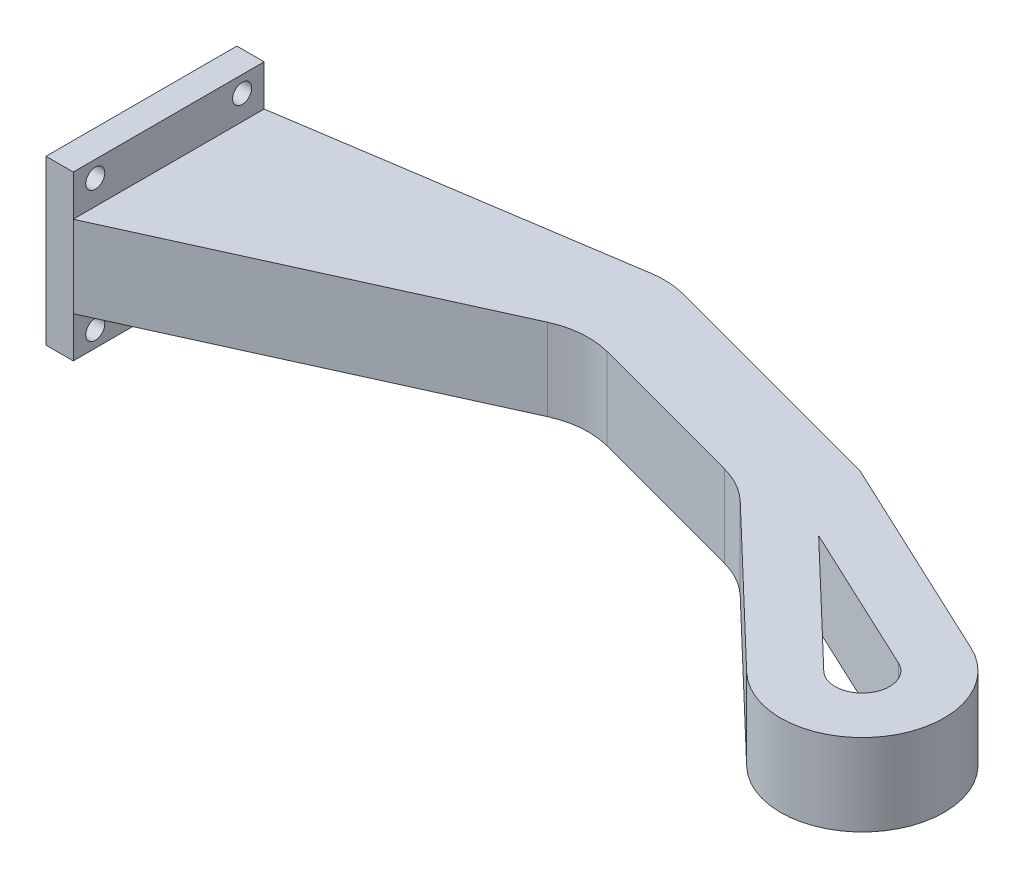
ISO-10303-21;
HEADER;
FILE_DESCRIPTION(('STEP AP214'),'2;1');
FILE_NAME('part.step','',(''),(''),'','','');
FILE_SCHEMA(('AUTOMOTIVE_DESIGN { 1 0 10303 214 1 1 1 1 }'));
ENDSEC;
DATA;
#1=APPLICATION_CONTEXT('core data for automotive mechanical design processes');
#2=APPLICATION_PROTOCOL_DEFINITION('international standard','automotive_design',2000,#1);
#3=PRODUCT_CONTEXT('',#1,'mechanical');
#4=PRODUCT('Part','Part','',(#3));
#5=PRODUCT_RELATED_PRODUCT_CATEGORY('part','',(#4));
#6=PRODUCT_DEFINITION_FORMATION('','',#4);
#7=PRODUCT_DEFINITION_CONTEXT('part definition',#1,'design');
#8=PRODUCT_DEFINITION('design','',#6,#7);
#9=PRODUCT_DEFINITION_SHAPE('','',#8);
#10=(LENGTH_UNIT() NAMED_UNIT(*) SI_UNIT(.MILLI.,.METRE.));
#11=(NAMED_UNIT(*) PLANE_ANGLE_UNIT() SI_UNIT($,.RADIAN.));
#12=(NAMED_UNIT(*) SI_UNIT($,.STERADIAN.) SOLID_ANGLE_UNIT());
#13=UNCERTAINTY_MEASURE_WITH_UNIT(LENGTH_MEASURE(1.E-05),#10,'distance_accuracy_value','');
#14=(GEOMETRIC_REPRESENTATION_CONTEXT(3) GLOBAL_UNCERTAINTY_ASSIGNED_CONTEXT((#13)) GLOBAL_UNIT_ASSIGNED_CONTEXT((#10,
#11,#12)) REPRESENTATION_CONTEXT('',''));
#15=CARTESIAN_POINT('',(0.,0.,0.));
#16=DIRECTION('',(0.,0.,1.));
#17=DIRECTION('',(1.,0.,0.));
#18=AXIS2_PLACEMENT_3D('',#15,#16,#17);
#19=CARTESIAN_POINT('',(149.048915943772,7.5,16.8647755984582));
#20=DIRECTION('',(0.,1.,0.));
#21=DIRECTION('',(0.,0.,1.));
#22=AXIS2_PLACEMENT_3D('',#19,#20,#21);
#23=PLANE('',#22);
#24=DIRECTION('',(-0.965903534010619,0.,-0.258902226691461));
#25=VECTOR('',#24,1.);
#26=CARTESIAN_POINT('',(69.6997046291097,7.5,-27.3658109257044));
#27=LINE('',#26,#25);
#28=CARTESIAN_POINT('',(117.129901337432,7.5,-14.6525501208592));
#29=VERTEX_POINT('',#28);
#30=CARTESIAN_POINT('',(72.7364139699548,7.5,-26.5518468159604));
#31=VERTEX_POINT('',#30);
#32=EDGE_CURVE('E249',#29,#31,#27,.T.);
#33=ORIENTED_EDGE('',*,*,#32,.T.);
#34=CARTESIAN_POINT('',(68.8528805695829,7.5,-12.0632938058011));
#35=DIRECTION('',(0.,1.,0.));
#36=DIRECTION('',(0.,0.,1.));
#37=AXIS2_PLACEMENT_3D('',#34,#35,#36);
#38=CIRCLE('',#37,15.);
#39=CARTESIAN_POINT('',(66.5917250141009,7.5,-26.8918869809446));
#40=VERTEX_POINT('',#39);
#41=EDGE_CURVE('E319',#31,#40,#38,.T.);
#42=ORIENTED_EDGE('',*,*,#41,.T.);
#43=DIRECTION('',(-0.988572878342901,0.,0.150743703698801));
#44=VECTOR('',#43,1.);
#45=CARTESIAN_POINT('',(5.,7.5,-17.5));
#46=LINE('',#45,#44);
#47=CARTESIAN_POINT('',(5.,7.5,-17.5));
#48=VERTEX_POINT('',#47);
#49=EDGE_CURVE('E252',#40,#48,#46,.T.);
#50=ORIENTED_EDGE('',*,*,#49,.T.);
#51=DIRECTION('',(0.,0.,1.));
#52=VECTOR('',#51,1.);
#53=CARTESIAN_POINT('',(5.,7.5,-17.5));
#54=LINE('',#53,#52);
#55=CARTESIAN_POINT('',(5.,7.5,17.5));
#56=VERTEX_POINT('',#55);
#57=EDGE_CURVE('E228',#48,#56,#54,.T.);
#58=ORIENTED_EDGE('',*,*,#57,.T.);
#59=DIRECTION('',(0.910751316432554,0.,-0.412955251348581));
#60=VECTOR('',#59,1.);
#61=CARTESIAN_POINT('',(5.,7.5,17.5));
#62=LINE('',#61,#60);
#63=CARTESIAN_POINT('',(64.8088605633866,7.5,-9.61869047147805));
#64=VERTEX_POINT('',#63);
#65=EDGE_CURVE('E232',#56,#64,#62,.T.);
#66=ORIENTED_EDGE('',*,*,#65,.T.);
#67=CARTESIAN_POINT('',(71.0031893336154,7.5,4.04257927501026));
#68=DIRECTION('',(0.,1.,0.));
#69=DIRECTION('',(0.,0.,1.));
#70=AXIS2_PLACEMENT_3D('',#67,#68,#69);
#71=CIRCLE('',#70,15.);
#72=CARTESIAN_POINT('',(74.8867227339873,7.5,-10.445973735149));
#73=VERTEX_POINT('',#72);
#74=EDGE_CURVE('E13',#64,#73,#71,.F.);
#75=ORIENTED_EDGE('',*,*,#74,.T.);
#76=DIRECTION('',(0.965903534010619,0.,0.258902226691461));
#77=VECTOR('',#76,1.);
#78=CARTESIAN_POINT('',(69.6997046291097,7.5,-11.8363098194013));
#79=LINE('',#78,#77);
#80=CARTESIAN_POINT('',(104.425689613895,7.5,-2.52830490996257));
#81=VERTEX_POINT('',#80);
#82=EDGE_CURVE('E236',#73,#81,#79,.T.);
#83=ORIENTED_EDGE('',*,*,#82,.T.);
#84=CARTESIAN_POINT('',(100.542156213523,7.5,11.9602481001967));
#85=DIRECTION('',(0.,1.,0.));
#86=DIRECTION('',(0.,0.,1.));
#87=AXIS2_PLACEMENT_3D('',#84,#85,#86);
#88=CIRCLE('',#87,15.);
#89=CARTESIAN_POINT('',(110.91479460911,7.5,1.12473368165718));
#90=VERTEX_POINT('',#89);
#91=EDGE_CURVE('E327',#81,#90,#88,.F.);
#92=ORIENTED_EDGE('',*,*,#91,.T.);
#93=DIRECTION('',(0.722367627902636,0.,0.691509226372518));
#94=VECTOR('',#93,1.);
#95=CARTESIAN_POINT('',(108.138274173085,7.5,-1.53317819667314));
#96=LINE('',#95,#94);
#97=CARTESIAN_POINT('',(138.676277548184,7.5,27.7002900169978));
#98=VERTEX_POINT('',#97);
#99=EDGE_CURVE('E240',#90,#98,#96,.T.);
#100=ORIENTED_EDGE('',*,*,#99,.T.);
#101=CARTESIAN_POINT('',(149.048915943772,7.5,16.8647755984582));
#102=DIRECTION('',(0.,1.,0.));
#103=DIRECTION('',(0.,0.,1.));
#104=AXIS2_PLACEMENT_3D('',#101,#102,#103);
#105=CIRCLE('',#104,15.);
#106=CARTESIAN_POINT('',(155.412254056418,7.5,3.2814060583128));
#107=VERTEX_POINT('',#106);
#108=EDGE_CURVE('E243',#98,#107,#105,.T.);
#109=ORIENTED_EDGE('',*,*,#108,.T.);
#110=DIRECTION('',(-0.905557969343029,0.,-0.424222540843046));
#111=VECTOR('',#110,1.);
#112=CARTESIAN_POINT('',(117.129901337432,7.5,-14.6525501208592));
#113=LINE('',#112,#111);
#114=EDGE_CURVE('E246',#107,#29,#113,.T.);
#115=ORIENTED_EDGE('',*,*,#114,.T.);
#116=EDGE_LOOP('',(#33,#42,#50,#58,#66,#75,#83,#92,#100,#109,#115));
#117=FACE_BOUND('',#116,.T.);
#118=CARTESIAN_POINT('',(149.048915943772,7.5,16.8647755984582));
#119=DIRECTION('',(0.,1.,0.));
#120=DIRECTION('',(1.,0.,0.));
#121=AXIS2_PLACEMENT_3D('',#118,#119,#120);
#122=CIRCLE('',#121,5.);
#123=CARTESIAN_POINT('',(145.59136981191,7.49999999999999,20.4766137379714));
#124=VERTEX_POINT('',#123);
#125=CARTESIAN_POINT('',(151.170028647987,7.5,12.3369857517431));
#126=VERTEX_POINT('',#125);
#127=EDGE_CURVE('E198',#124,#126,#122,.T.);
#128=ORIENTED_EDGE('',*,*,#127,.F.);
#129=DIRECTION('',(0.722367627902636,0.,0.691509226372518));
#130=VECTOR('',#129,1.);
#131=CARTESIAN_POINT('',(115.05336643681,7.5,-8.7568544756995));
#132=LINE('',#131,#130);
#133=CARTESIAN_POINT('',(123.593252888224,7.5,-0.581778454542834));
#134=VERTEX_POINT('',#133);
#135=EDGE_CURVE('E187',#134,#124,#132,.T.);
#136=ORIENTED_EDGE('',*,*,#135,.F.);
#137=DIRECTION('',(-0.905557969343029,0.,-0.424222540843046));
#138=VECTOR('',#137,1.);
#139=CARTESIAN_POINT('',(112.887675929001,7.5,-5.59697042742894));
#140=LINE('',#139,#138);
#141=EDGE_CURVE('E210',#126,#134,#140,.T.);
#142=ORIENTED_EDGE('',*,*,#141,.F.);
#143=EDGE_LOOP('',(#128,#136,#142));
#144=FACE_BOUND('',#143,.T.);
#145=ADVANCED_FACE('F82',(#117,#144),#23,.T.);
#146=CARTESIAN_POINT('',(149.048915943772,-7.5,16.8647755984582));
#147=DIRECTION('',(0.,1.,0.));
#148=DIRECTION('',(0.,0.,1.));
#149=AXIS2_PLACEMENT_3D('',#146,#147,#148);
#150=PLANE('',#149);
#151=DIRECTION('',(-0.988572878342901,0.,0.150743703698801));
#152=VECTOR('',#151,1.);
#153=CARTESIAN_POINT('',(5.,-7.5,-17.5));
#154=LINE('',#153,#152);
#155=CARTESIAN_POINT('',(66.5917250141009,-7.5,-26.8918869809446));
#156=VERTEX_POINT('',#155);
#157=CARTESIAN_POINT('',(5.,-7.5,-17.5));
#158=VERTEX_POINT('',#157);
#159=EDGE_CURVE('E233',#156,#158,#154,.T.);
#160=ORIENTED_EDGE('',*,*,#159,.F.);
#161=CARTESIAN_POINT('',(68.8528805695829,-7.5,-12.0632938058011));
#162=DIRECTION('',(0.,1.,0.));
#163=DIRECTION('',(0.,0.,1.));
#164=AXIS2_PLACEMENT_3D('',#161,#162,#163);
#165=CIRCLE('',#164,15.);
#166=CARTESIAN_POINT('',(72.7364139699548,-7.5,-26.5518468159604));
#167=VERTEX_POINT('',#166);
#168=EDGE_CURVE('E314',#156,#167,#165,.F.);
#169=ORIENTED_EDGE('',*,*,#168,.T.);
#170=DIRECTION('',(-0.965903534010619,0.,-0.258902226691461));
#171=VECTOR('',#170,1.);
#172=CARTESIAN_POINT('',(69.6997046291097,-7.5,-27.3658109257044));
#173=LINE('',#172,#171);
#174=CARTESIAN_POINT('',(117.129901337432,-7.5,-14.6525501208592));
#175=VERTEX_POINT('',#174);
#176=EDGE_CURVE('E275',#175,#167,#173,.T.);
#177=ORIENTED_EDGE('',*,*,#176,.F.);
#178=DIRECTION('',(-0.905557969343029,0.,-0.424222540843046));
#179=VECTOR('',#178,1.);
#180=CARTESIAN_POINT('',(117.129901337432,-7.5,-14.6525501208592));
#181=LINE('',#180,#179);
#182=CARTESIAN_POINT('',(155.412254056418,-7.5,3.2814060583128));
#183=VERTEX_POINT('',#182);
#184=EDGE_CURVE('E272',#183,#175,#181,.T.);
#185=ORIENTED_EDGE('',*,*,#184,.F.);
#186=CARTESIAN_POINT('',(149.048915943772,-7.5,16.8647755984582));
#187=DIRECTION('',(0.,1.,0.));
#188=DIRECTION('',(0.,0.,1.));
#189=AXIS2_PLACEMENT_3D('',#186,#187,#188);
#190=CIRCLE('',#189,15.);
#191=CARTESIAN_POINT('',(138.676277548184,-7.5,27.7002900169978));
#192=VERTEX_POINT('',#191);
#193=EDGE_CURVE('E269',#192,#183,#190,.T.);
#194=ORIENTED_EDGE('',*,*,#193,.F.);
#195=DIRECTION('',(0.722367627902636,0.,0.691509226372518));
#196=VECTOR('',#195,1.);
#197=CARTESIAN_POINT('',(108.138274173085,-7.5,-1.53317819667314));
#198=LINE('',#197,#196);
#199=CARTESIAN_POINT('',(110.91479460911,-7.5,1.12473368165718));
#200=VERTEX_POINT('',#199);
#201=EDGE_CURVE('E266',#200,#192,#198,.T.);
#202=ORIENTED_EDGE('',*,*,#201,.F.);
#203=CARTESIAN_POINT('',(100.542156213523,-7.5,11.9602481001967));
#204=DIRECTION('',(0.,1.,0.));
#205=DIRECTION('',(0.,0.,1.));
#206=AXIS2_PLACEMENT_3D('',#203,#204,#205);
#207=CIRCLE('',#206,15.);
#208=CARTESIAN_POINT('',(104.425689613895,-7.5,-2.52830490996257));
#209=VERTEX_POINT('',#208);
#210=EDGE_CURVE('E324',#200,#209,#207,.T.);
#211=ORIENTED_EDGE('',*,*,#210,.T.);
#212=DIRECTION('',(0.965903534010619,0.,0.258902226691461));
#213=VECTOR('',#212,1.);
#214=CARTESIAN_POINT('',(69.6997046291097,-7.5,-11.8363098194013));
#215=LINE('',#214,#213);
#216=CARTESIAN_POINT('',(74.8867227339873,-7.5,-10.445973735149));
#217=VERTEX_POINT('',#216);
#218=EDGE_CURVE('E262',#217,#209,#215,.T.);
#219=ORIENTED_EDGE('',*,*,#218,.F.);
#220=CARTESIAN_POINT('',(71.0031893336154,-7.5,4.04257927501026));
#221=DIRECTION('',(0.,1.,0.));
#222=DIRECTION('',(0.,0.,1.));
#223=AXIS2_PLACEMENT_3D('',#220,#221,#222);
#224=CIRCLE('',#223,15.);
#225=CARTESIAN_POINT('',(64.8088605633866,-7.5,-9.61869047147805));
#226=VERTEX_POINT('',#225);
#227=EDGE_CURVE('E91',#217,#226,#224,.T.);
#228=ORIENTED_EDGE('',*,*,#227,.T.);
#229=DIRECTION('',(0.910751316432554,0.,-0.412955251348581));
#230=VECTOR('',#229,1.);
#231=CARTESIAN_POINT('',(5.,-7.5,17.5));
#232=LINE('',#231,#230);
#233=CARTESIAN_POINT('',(5.,-7.5,17.5));
#234=VERTEX_POINT('',#233);
#235=EDGE_CURVE('E259',#234,#226,#232,.T.);
#236=ORIENTED_EDGE('',*,*,#235,.F.);
#237=DIRECTION('',(0.,0.,1.));
#238=VECTOR('',#237,1.);
#239=CARTESIAN_POINT('',(5.,-7.5,-17.5));
#240=LINE('',#239,#238);
#241=EDGE_CURVE('E207',#158,#234,#240,.T.);
#242=ORIENTED_EDGE('',*,*,#241,.F.);
#243=EDGE_LOOP('',(#160,#169,#177,#185,#194,#202,#211,#219,#228,#236,#242));
#244=FACE_BOUND('',#243,.T.);
#245=DIRECTION('',(0.722367627902636,0.,0.691509226372518));
#246=VECTOR('',#245,1.);
#247=CARTESIAN_POINT('',(115.05336643681,-7.5,-8.7568544756995));
#248=LINE('',#247,#246);
#249=CARTESIAN_POINT('',(123.593252888224,-7.5,-0.581778454542832));
#250=VERTEX_POINT('',#249);
#251=CARTESIAN_POINT('',(145.59136981191,-7.50000000000001,20.4766137379714));
#252=VERTEX_POINT('',#251);
#253=EDGE_CURVE('E216',#250,#252,#248,.T.);
#254=ORIENTED_EDGE('',*,*,#253,.T.);
#255=CARTESIAN_POINT('',(149.048915943772,-7.5,16.8647755984582));
#256=DIRECTION('',(0.,1.,0.));
#257=DIRECTION('',(1.,0.,0.));
#258=AXIS2_PLACEMENT_3D('',#255,#256,#257);
#259=CIRCLE('',#258,5.);
#260=CARTESIAN_POINT('',(151.170028647987,-7.5,12.3369857517431));
#261=VERTEX_POINT('',#260);
#262=EDGE_CURVE('E205',#252,#261,#259,.T.);
#263=ORIENTED_EDGE('',*,*,#262,.T.);
#264=DIRECTION('',(-0.905557969343029,0.,-0.424222540843046));
#265=VECTOR('',#264,1.);
#266=CARTESIAN_POINT('',(112.887675929001,-7.5,-5.59697042742894));
#267=LINE('',#266,#265);
#268=EDGE_CURVE('E199',#261,#250,#267,.T.);
#269=ORIENTED_EDGE('',*,*,#268,.T.);
#270=EDGE_LOOP('',(#254,#263,#269));
#271=FACE_BOUND('',#270,.T.);
#272=ADVANCED_FACE('F333',(#244,#271),#150,.F.);
#273=CARTESIAN_POINT('',(5.,7.5,-17.5));
#274=DIRECTION('',(1.,0.,0.));
#275=DIRECTION('',(0.,0.,-1.));
#276=AXIS2_PLACEMENT_3D('',#273,#274,#275);
#277=PLANE('',#276);
#278=ORIENTED_EDGE('',*,*,#241,.T.);
#279=DIRECTION('',(0.,-1.,0.));
#280=VECTOR('',#279,1.);
#281=CARTESIAN_POINT('',(5.,7.5,17.5));
#282=LINE('',#281,#280);
#283=EDGE_CURVE('E295',#56,#234,#282,.T.);
#284=ORIENTED_EDGE('',*,*,#283,.F.);
#285=ORIENTED_EDGE('',*,*,#57,.F.);
#286=DIRECTION('',(0.,-1.,0.));
#287=VECTOR('',#286,1.);
#288=CARTESIAN_POINT('',(5.,7.5,-17.5));
#289=LINE('',#288,#287);
#290=EDGE_CURVE('E255',#48,#158,#289,.T.);
#291=ORIENTED_EDGE('',*,*,#290,.T.);
#292=EDGE_LOOP('',(#278,#284,#285,#291));
#293=FACE_BOUND('',#292,.T.);
#294=ADVANCED_FACE('F383',(#293),#277,.F.);
#295=CARTESIAN_POINT('',(5.,7.5,17.5));
#296=DIRECTION('',(-0.412955251348581,0.,-0.910751316432554));
#297=DIRECTION('',(-0.910751316432554,0.,0.412955251348581));
#298=AXIS2_PLACEMENT_3D('',#295,#296,#297);
#299=PLANE('',#298);
#300=ORIENTED_EDGE('',*,*,#235,.T.);
#301=DIRECTION('',(0.,-1.,0.));
#302=VECTOR('',#301,1.);
#303=CARTESIAN_POINT('',(64.8088605633867,7.5,-9.61869047147804));
#304=LINE('',#303,#302);
#305=EDGE_CURVE('E98',#226,#64,#304,.F.);
#306=ORIENTED_EDGE('',*,*,#305,.T.);
#307=ORIENTED_EDGE('',*,*,#65,.F.);
#308=ORIENTED_EDGE('',*,*,#283,.T.);
#309=EDGE_LOOP('',(#300,#306,#307,#308));
#310=FACE_BOUND('',#309,.T.);
#311=ADVANCED_FACE('F338',(#310),#299,.F.);
#312=CARTESIAN_POINT('',(69.6997046291097,7.5,-11.8363098194013));
#313=DIRECTION('',(0.258902226691461,0.,-0.965903534010619));
#314=DIRECTION('',(-0.965903534010619,0.,-0.258902226691461));
#315=AXIS2_PLACEMENT_3D('',#312,#313,#314);
#316=PLANE('',#315);
#317=ORIENTED_EDGE('',*,*,#218,.T.);
#318=DIRECTION('',(0.,-1.,0.));
#319=VECTOR('',#318,1.);
#320=CARTESIAN_POINT('',(104.425689613895,7.5,-2.52830490996257));
#321=LINE('',#320,#319);
#322=EDGE_CURVE('E307',#209,#81,#321,.F.);
#323=ORIENTED_EDGE('',*,*,#322,.T.);
#324=ORIENTED_EDGE('',*,*,#82,.F.);
#325=DIRECTION('',(0.,-1.,0.));
#326=VECTOR('',#325,1.);
#327=CARTESIAN_POINT('',(74.8867227339873,-7.5,-10.445973735149));
#328=LINE('',#327,#326);
#329=EDGE_CURVE('E303',#73,#217,#328,.T.);
#330=ORIENTED_EDGE('',*,*,#329,.T.);
#331=EDGE_LOOP('',(#317,#323,#324,#330));
#332=FACE_BOUND('',#331,.T.);
#333=ADVANCED_FACE('F345',(#332),#316,.F.);
#334=CARTESIAN_POINT('',(108.138274173085,7.5,-1.53317819667314));
#335=DIRECTION('',(0.691509226372518,0.,-0.722367627902636));
#336=DIRECTION('',(-0.722367627902636,0.,-0.691509226372518));
#337=AXIS2_PLACEMENT_3D('',#334,#335,#336);
#338=PLANE('',#337);
#339=ORIENTED_EDGE('',*,*,#99,.F.);
#340=DIRECTION('',(0.,-1.,0.));
#341=VECTOR('',#340,1.);
#342=CARTESIAN_POINT('',(110.91479460911,-7.5,1.12473368165717));
#343=LINE('',#342,#341);
#344=EDGE_CURVE('E299',#90,#200,#343,.T.);
#345=ORIENTED_EDGE('',*,*,#344,.T.);
#346=ORIENTED_EDGE('',*,*,#201,.T.);
#347=DIRECTION('',(0.,-1.,0.));
#348=VECTOR('',#347,1.);
#349=CARTESIAN_POINT('',(138.676277548184,7.5,27.7002900169978));
#350=LINE('',#349,#348);
#351=EDGE_CURVE('E291',#98,#192,#350,.T.);
#352=ORIENTED_EDGE('',*,*,#351,.F.);
#353=EDGE_LOOP('',(#339,#345,#346,#352));
#354=FACE_BOUND('',#353,.T.);
#355=ADVANCED_FACE('F353',(#354),#338,.F.);
#356=CARTESIAN_POINT('',(149.048915943772,7.5,16.8647755984582));
#357=DIRECTION('',(0.,-1.,0.));
#358=DIRECTION('',(0.,0.,-1.));
#359=AXIS2_PLACEMENT_3D('',#356,#357,#358);
#360=CYLINDRICAL_SURFACE('',#359,15.);
#361=ORIENTED_EDGE('',*,*,#193,.T.);
#362=DIRECTION('',(0.,-1.,0.));
#363=VECTOR('',#362,1.);
#364=CARTESIAN_POINT('',(155.412254056418,7.5,3.2814060583128));
#365=LINE('',#364,#363);
#366=EDGE_CURVE('E287',#107,#183,#365,.T.);
#367=ORIENTED_EDGE('',*,*,#366,.F.);
#368=ORIENTED_EDGE('',*,*,#108,.F.);
#369=ORIENTED_EDGE('',*,*,#351,.T.);
#370=EDGE_LOOP('',(#361,#367,#368,#369));
#371=FACE_BOUND('',#370,.T.);
#372=ADVANCED_FACE('F359',(#371),#360,.T.);
#373=CARTESIAN_POINT('',(117.129901337432,7.5,-14.6525501208592));
#374=DIRECTION('',(-0.424222540843046,0.,0.905557969343029));
#375=DIRECTION('',(0.905557969343029,0.,0.424222540843046));
#376=AXIS2_PLACEMENT_3D('',#373,#374,#375);
#377=PLANE('',#376);
#378=ORIENTED_EDGE('',*,*,#184,.T.);
#379=DIRECTION('',(0.,-1.,0.));
#380=VECTOR('',#379,1.);
#381=CARTESIAN_POINT('',(117.129901337432,7.5,-14.6525501208592));
#382=LINE('',#381,#380);
#383=EDGE_CURVE('E283',#29,#175,#382,.T.);
#384=ORIENTED_EDGE('',*,*,#383,.F.);
#385=ORIENTED_EDGE('',*,*,#114,.F.);
#386=ORIENTED_EDGE('',*,*,#366,.T.);
#387=EDGE_LOOP('',(#378,#384,#385,#386));
#388=FACE_BOUND('',#387,.T.);
#389=ADVANCED_FACE('F364',(#388),#377,.F.);
#390=CARTESIAN_POINT('',(69.6997046291097,7.5,-27.3658109257044));
#391=DIRECTION('',(-0.258902226691461,0.,0.965903534010619));
#392=DIRECTION('',(0.965903534010619,0.,0.258902226691461));
#393=AXIS2_PLACEMENT_3D('',#390,#391,#392);
#394=PLANE('',#393);
#395=ORIENTED_EDGE('',*,*,#176,.T.);
#396=DIRECTION('',(0.,-1.,0.));
#397=VECTOR('',#396,1.);
#398=CARTESIAN_POINT('',(72.7364139699548,7.5,-26.5518468159604));
#399=LINE('',#398,#397);
#400=EDGE_CURVE('E106',#167,#31,#399,.F.);
#401=ORIENTED_EDGE('',*,*,#400,.T.);
#402=ORIENTED_EDGE('',*,*,#32,.F.);
#403=ORIENTED_EDGE('',*,*,#383,.T.);
#404=EDGE_LOOP('',(#395,#401,#402,#403));
#405=FACE_BOUND('',#404,.T.);
#406=ADVANCED_FACE('F367',(#405),#394,.F.);
#407=CARTESIAN_POINT('',(5.,7.5,-17.5));
#408=DIRECTION('',(0.150743703698801,0.,0.988572878342901));
#409=DIRECTION('',(0.988572878342901,0.,-0.150743703698801));
#410=AXIS2_PLACEMENT_3D('',#407,#408,#409);
#411=PLANE('',#410);
#412=ORIENTED_EDGE('',*,*,#49,.F.);
#413=DIRECTION('',(0.,-1.,0.));
#414=VECTOR('',#413,1.);
#415=CARTESIAN_POINT('',(66.5917250141009,7.5,-26.8918869809446));
#416=LINE('',#415,#414);
#417=EDGE_CURVE('E310',#40,#156,#416,.T.);
#418=ORIENTED_EDGE('',*,*,#417,.T.);
#419=ORIENTED_EDGE('',*,*,#159,.T.);
#420=ORIENTED_EDGE('',*,*,#290,.F.);
#421=EDGE_LOOP('',(#412,#418,#419,#420));
#422=FACE_BOUND('',#421,.T.);
#423=ADVANCED_FACE('F369',(#422),#411,.F.);
#424=CARTESIAN_POINT('',(115.05336643681,7.5,-8.7568544756995));
#425=DIRECTION('',(0.691509226372518,0.,-0.722367627902636));
#426=DIRECTION('',(-0.722367627902636,0.,-0.691509226372518));
#427=AXIS2_PLACEMENT_3D('',#424,#425,#426);
#428=PLANE('',#427);
#429=ORIENTED_EDGE('',*,*,#253,.F.);
#430=DIRECTION('',(0.,-1.,0.));
#431=VECTOR('',#430,1.);
#432=CARTESIAN_POINT('',(123.593252888224,7.5,-0.581778454542834));
#433=LINE('',#432,#431);
#434=EDGE_CURVE('E193',#134,#250,#433,.T.);
#435=ORIENTED_EDGE('',*,*,#434,.F.);
#436=ORIENTED_EDGE('',*,*,#135,.T.);
#437=DIRECTION('',(0.,-1.,0.));
#438=VECTOR('',#437,1.);
#439=CARTESIAN_POINT('',(145.59136981191,7.49999999999999,20.4766137379714));
#440=LINE('',#439,#438);
#441=EDGE_CURVE('E190',#124,#252,#440,.T.);
#442=ORIENTED_EDGE('',*,*,#441,.T.);
#443=EDGE_LOOP('',(#429,#435,#436,#442));
#444=FACE_BOUND('',#443,.T.);
#445=ADVANCED_FACE('F189',(#444),#428,.T.);
#446=CARTESIAN_POINT('',(149.048915943772,7.5,16.8647755984582));
#447=DIRECTION('',(0.,-1.,0.));
#448=DIRECTION('',(0.,0.,-1.));
#449=AXIS2_PLACEMENT_3D('',#446,#447,#448);
#450=CYLINDRICAL_SURFACE('',#449,5.);
#451=ORIENTED_EDGE('',*,*,#262,.F.);
#452=ORIENTED_EDGE('',*,*,#441,.F.);
#453=ORIENTED_EDGE('',*,*,#127,.T.);
#454=DIRECTION('',(0.,-1.,0.));
#455=VECTOR('',#454,1.);
#456=CARTESIAN_POINT('',(151.170028647987,7.5,12.3369857517431));
#457=LINE('',#456,#455);
#458=EDGE_CURVE('E208',#126,#261,#457,.T.);
#459=ORIENTED_EDGE('',*,*,#458,.T.);
#460=EDGE_LOOP('',(#451,#452,#453,#459));
#461=FACE_BOUND('',#460,.T.);
#462=ADVANCED_FACE('F203',(#461),#450,.F.);
#463=CARTESIAN_POINT('',(112.887675929001,7.5,-5.59697042742894));
#464=DIRECTION('',(-0.424222540843046,0.,0.905557969343029));
#465=DIRECTION('',(0.905557969343029,0.,0.424222540843046));
#466=AXIS2_PLACEMENT_3D('',#463,#464,#465);
#467=PLANE('',#466);
#468=ORIENTED_EDGE('',*,*,#268,.F.);
#469=ORIENTED_EDGE('',*,*,#458,.F.);
#470=ORIENTED_EDGE('',*,*,#141,.T.);
#471=ORIENTED_EDGE('',*,*,#434,.T.);
#472=EDGE_LOOP('',(#468,#469,#470,#471));
#473=FACE_BOUND('',#472,.T.);
#474=ADVANCED_FACE('F390',(#473),#467,.T.);
#475=CARTESIAN_POINT('',(100.542156213523,7.5,11.9602481001967));
#476=DIRECTION('',(0.,1.,0.));
#477=DIRECTION('',(0.,0.,1.));
#478=AXIS2_PLACEMENT_3D('',#475,#476,#477);
#479=CYLINDRICAL_SURFACE('',#478,15.);
#480=ORIENTED_EDGE('',*,*,#91,.F.);
#481=ORIENTED_EDGE('',*,*,#322,.F.);
#482=ORIENTED_EDGE('',*,*,#210,.F.);
#483=ORIENTED_EDGE('',*,*,#344,.F.);
#484=EDGE_LOOP('',(#480,#481,#482,#483));
#485=FACE_BOUND('',#484,.T.);
#486=ADVANCED_FACE('F348',(#485),#479,.F.);
#487=CARTESIAN_POINT('',(68.8528805695829,7.5,-12.0632938058011));
#488=DIRECTION('',(0.,-1.,0.));
#489=DIRECTION('',(0.,0.,-1.));
#490=AXIS2_PLACEMENT_3D('',#487,#488,#489);
#491=CYLINDRICAL_SURFACE('',#490,15.);
#492=ORIENTED_EDGE('',*,*,#41,.F.);
#493=ORIENTED_EDGE('',*,*,#400,.F.);
#494=ORIENTED_EDGE('',*,*,#168,.F.);
#495=ORIENTED_EDGE('',*,*,#417,.F.);
#496=EDGE_LOOP('',(#492,#493,#494,#495));
#497=FACE_BOUND('',#496,.T.);
#498=ADVANCED_FACE('F396',(#497),#491,.T.);
#499=CARTESIAN_POINT('',(71.0031893336154,7.5,4.04257927501026));
#500=DIRECTION('',(0.,1.,0.));
#501=DIRECTION('',(0.,0.,1.));
#502=AXIS2_PLACEMENT_3D('',#499,#500,#501);
#503=CYLINDRICAL_SURFACE('',#502,15.);
#504=ORIENTED_EDGE('',*,*,#74,.F.);
#505=ORIENTED_EDGE('',*,*,#305,.F.);
#506=ORIENTED_EDGE('',*,*,#227,.F.);
#507=ORIENTED_EDGE('',*,*,#329,.F.);
#508=EDGE_LOOP('',(#504,#505,#506,#507));
#509=FACE_BOUND('',#508,.T.);
#510=ADVANCED_FACE('F84',(#509),#503,.F.);
#511=CLOSED_SHELL('',(#145,#272,#294,#311,#333,#355,#372,#389,#406,#423,#445,#462,#474,#486,
#498,#510));
#512=MANIFOLD_SOLID_BREP('B2',#511);
#513=CARTESIAN_POINT('',(5.,15.,17.5));
#514=DIRECTION('',(0.,0.,-1.));
#515=DIRECTION('',(-1.,0.,0.));
#516=AXIS2_PLACEMENT_3D('',#513,#514,#515);
#517=PLANE('',#516);
#518=DIRECTION('',(0.,-1.,0.));
#519=VECTOR('',#518,1.);
#520=CARTESIAN_POINT('',(0.,15.,17.5));
#521=LINE('',#520,#519);
#522=CARTESIAN_POINT('',(0.,15.,17.5));
#523=VERTEX_POINT('',#522);
#524=CARTESIAN_POINT('',(0.,-15.,17.5));
#525=VERTEX_POINT('',#524);
#526=EDGE_CURVE('E579',#523,#525,#521,.T.);
#527=ORIENTED_EDGE('',*,*,#526,.T.);
#528=DIRECTION('',(-1.,0.,0.));
#529=VECTOR('',#528,1.);
#530=CARTESIAN_POINT('',(5.,-15.,17.5));
#531=LINE('',#530,#529);
#532=CARTESIAN_POINT('',(5.,-15.,17.5));
#533=VERTEX_POINT('',#532);
#534=EDGE_CURVE('E80',#533,#525,#531,.T.);
#535=ORIENTED_EDGE('',*,*,#534,.F.);
#536=DIRECTION('',(0.,-1.,0.));
#537=VECTOR('',#536,1.);
#538=CARTESIAN_POINT('',(5.,15.,17.5));
#539=LINE('',#538,#537);
#540=CARTESIAN_POINT('',(5.,15.,17.5));
#541=VERTEX_POINT('',#540);
#542=EDGE_CURVE('E567',#541,#533,#539,.T.);
#543=ORIENTED_EDGE('',*,*,#542,.F.);
#544=DIRECTION('',(-1.,0.,0.));
#545=VECTOR('',#544,1.);
#546=CARTESIAN_POINT('',(5.,15.,17.5));
#547=LINE('',#546,#545);
#548=EDGE_CURVE('E575',#541,#523,#547,.T.);
#549=ORIENTED_EDGE('',*,*,#548,.T.);
#550=EDGE_LOOP('',(#527,#535,#543,#549));
#551=FACE_BOUND('',#550,.T.);
#552=ADVANCED_FACE('F516',(#551),#517,.F.);
#553=CARTESIAN_POINT('',(5.,-15.,17.5));
#554=DIRECTION('',(0.,1.,0.));
#555=DIRECTION('',(0.,0.,1.));
#556=AXIS2_PLACEMENT_3D('',#553,#554,#555);
#557=PLANE('',#556);
#558=DIRECTION('',(0.,0.,-1.));
#559=VECTOR('',#558,1.);
#560=CARTESIAN_POINT('',(0.,-15.,17.5));
#561=LINE('',#560,#559);
#562=CARTESIAN_POINT('',(0.,-15.,-17.5));
#563=VERTEX_POINT('',#562);
#564=EDGE_CURVE('E571',#525,#563,#561,.T.);
#565=ORIENTED_EDGE('',*,*,#564,.T.);
#566=DIRECTION('',(-1.,0.,0.));
#567=VECTOR('',#566,1.);
#568=CARTESIAN_POINT('',(5.,-15.,-17.5));
#569=LINE('',#568,#567);
#570=CARTESIAN_POINT('',(5.,-15.,-17.5));
#571=VERTEX_POINT('',#570);
#572=EDGE_CURVE('E524',#571,#563,#569,.T.);
#573=ORIENTED_EDGE('',*,*,#572,.F.);
#574=DIRECTION('',(0.,0.,-1.));
#575=VECTOR('',#574,1.);
#576=CARTESIAN_POINT('',(5.,-15.,17.5));
#577=LINE('',#576,#575);
#578=EDGE_CURVE('E562',#533,#571,#577,.T.);
#579=ORIENTED_EDGE('',*,*,#578,.F.);
#580=ORIENTED_EDGE('',*,*,#534,.T.);
#581=EDGE_LOOP('',(#565,#573,#579,#580));
#582=FACE_BOUND('',#581,.T.);
#583=ADVANCED_FACE('F570',(#582),#557,.F.);
#584=CARTESIAN_POINT('',(5.,15.,-17.5));
#585=DIRECTION('',(0.,0.,1.));
#586=DIRECTION('',(0.,-1.,0.));
#587=AXIS2_PLACEMENT_3D('',#584,#585,#586);
#588=PLANE('',#587);
#589=DIRECTION('',(0.,1.,0.));
#590=VECTOR('',#589,1.);
#591=CARTESIAN_POINT('',(0.,15.,-17.5));
#592=LINE('',#591,#590);
#593=CARTESIAN_POINT('',(0.,15.,-17.5));
#594=VERTEX_POINT('',#593);
#595=EDGE_CURVE('E549',#563,#594,#592,.T.);
#596=ORIENTED_EDGE('',*,*,#595,.T.);
#597=DIRECTION('',(-1.,0.,0.));
#598=VECTOR('',#597,1.);
#599=CARTESIAN_POINT('',(5.,15.,-17.5));
#600=LINE('',#599,#598);
#601=CARTESIAN_POINT('',(5.,15.,-17.5));
#602=VERTEX_POINT('',#601);
#603=EDGE_CURVE('E572',#602,#594,#600,.T.);
#604=ORIENTED_EDGE('',*,*,#603,.F.);
#605=DIRECTION('',(0.,1.,0.));
#606=VECTOR('',#605,1.);
#607=CARTESIAN_POINT('',(5.,15.,-17.5));
#608=LINE('',#607,#606);
#609=EDGE_CURVE('E565',#571,#602,#608,.T.);
#610=ORIENTED_EDGE('',*,*,#609,.F.);
#611=ORIENTED_EDGE('',*,*,#572,.T.);
#612=EDGE_LOOP('',(#596,#604,#610,#611));
#613=FACE_BOUND('',#612,.T.);
#614=ADVANCED_FACE('F573',(#613),#588,.F.);
#615=CARTESIAN_POINT('',(5.,15.,17.5));
#616=DIRECTION('',(0.,-1.,0.));
#617=DIRECTION('',(0.,0.,-1.));
#618=AXIS2_PLACEMENT_3D('',#615,#616,#617);
#619=PLANE('',#618);
#620=DIRECTION('',(0.,0.,1.));
#621=VECTOR('',#620,1.);
#622=CARTESIAN_POINT('',(0.,15.,17.5));
#623=LINE('',#622,#621);
#624=EDGE_CURVE('E555',#594,#523,#623,.T.);
#625=ORIENTED_EDGE('',*,*,#624,.T.);
#626=ORIENTED_EDGE('',*,*,#548,.F.);
#627=DIRECTION('',(0.,0.,1.));
#628=VECTOR('',#627,1.);
#629=CARTESIAN_POINT('',(5.,15.,17.5));
#630=LINE('',#629,#628);
#631=EDGE_CURVE('E532',#602,#541,#630,.T.);
#632=ORIENTED_EDGE('',*,*,#631,.F.);
#633=ORIENTED_EDGE('',*,*,#603,.T.);
#634=EDGE_LOOP('',(#625,#626,#632,#633));
#635=FACE_BOUND('',#634,.T.);
#636=ADVANCED_FACE('F587',(#635),#619,.F.);
#637=CARTESIAN_POINT('',(5.,0.,0.));
#638=DIRECTION('',(1.,0.,0.));
#639=DIRECTION('',(0.,0.,-1.));
#640=AXIS2_PLACEMENT_3D('',#637,#638,#639);
#641=PLANE('',#640);
#642=CARTESIAN_POINT('',(5.,12.,13.47));
#643=DIRECTION('',(1.,0.,0.));
#644=DIRECTION('',(0.,0.,-1.));
#645=AXIS2_PLACEMENT_3D('',#642,#643,#644);
#646=CIRCLE('',#645,1.75);
#647=CARTESIAN_POINT('',(5.,12.,11.72));
#648=VERTEX_POINT('',#647);
#649=EDGE_CURVE('E582',#648,#648,#646,.T.);
#650=ORIENTED_EDGE('',*,*,#649,.F.);
#651=EDGE_LOOP('',(#650));
#652=FACE_BOUND('',#651,.T.);
#653=CARTESIAN_POINT('',(5.,-12.,13.47));
#654=DIRECTION('',(1.,0.,0.));
#655=DIRECTION('',(0.,0.,-1.));
#656=AXIS2_PLACEMENT_3D('',#653,#654,#655);
#657=CIRCLE('',#656,1.75);
#658=CARTESIAN_POINT('',(5.,-12.,11.72));
#659=VERTEX_POINT('',#658);
#660=EDGE_CURVE('E595',#659,#659,#657,.T.);
#661=ORIENTED_EDGE('',*,*,#660,.F.);
#662=EDGE_LOOP('',(#661));
#663=FACE_BOUND('',#662,.T.);
#664=CARTESIAN_POINT('',(5.,-12.,-13.47));
#665=DIRECTION('',(1.,0.,0.));
#666=DIRECTION('',(0.,0.,-1.));
#667=AXIS2_PLACEMENT_3D('',#664,#665,#666);
#668=CIRCLE('',#667,1.75);
#669=CARTESIAN_POINT('',(5.,-12.,-15.22));
#670=VERTEX_POINT('',#669);
#671=EDGE_CURVE('E598',#670,#670,#668,.T.);
#672=ORIENTED_EDGE('',*,*,#671,.F.);
#673=EDGE_LOOP('',(#672));
#674=FACE_BOUND('',#673,.T.);
#675=CARTESIAN_POINT('',(5.,12.,-13.47));
#676=DIRECTION('',(1.,0.,0.));
#677=DIRECTION('',(0.,0.,-1.));
#678=AXIS2_PLACEMENT_3D('',#675,#676,#677);
#679=CIRCLE('',#678,1.75);
#680=CARTESIAN_POINT('',(5.,12.,-15.22));
#681=VERTEX_POINT('',#680);
#682=EDGE_CURVE('E601',#681,#681,#679,.T.);
#683=ORIENTED_EDGE('',*,*,#682,.F.);
#684=EDGE_LOOP('',(#683));
#685=FACE_BOUND('',#684,.T.);
#686=ORIENTED_EDGE('',*,*,#542,.T.);
#687=ORIENTED_EDGE('',*,*,#578,.T.);
#688=ORIENTED_EDGE('',*,*,#609,.T.);
#689=ORIENTED_EDGE('',*,*,#631,.T.);
#690=EDGE_LOOP('',(#686,#687,#688,#689));
#691=FACE_BOUND('',#690,.T.);
#692=ADVANCED_FACE('F563',(#652,#663,#674,#685,#691),#641,.T.);
#693=CARTESIAN_POINT('',(0.,0.,0.));
#694=DIRECTION('',(1.,0.,0.));
#695=DIRECTION('',(0.,0.,-1.));
#696=AXIS2_PLACEMENT_3D('',#693,#694,#695);
#697=PLANE('',#696);
#698=CARTESIAN_POINT('',(0.,12.,13.47));
#699=DIRECTION('',(-1.,0.,0.));
#700=DIRECTION('',(0.,0.,1.));
#701=AXIS2_PLACEMENT_3D('',#698,#699,#700);
#702=CIRCLE('',#701,1.75);
#703=CARTESIAN_POINT('',(0.,12.,15.22));
#704=VERTEX_POINT('',#703);
#705=EDGE_CURVE('E608',#704,#704,#702,.T.);
#706=ORIENTED_EDGE('',*,*,#705,.F.);
#707=EDGE_LOOP('',(#706));
#708=FACE_BOUND('',#707,.T.);
#709=CARTESIAN_POINT('',(0.,-12.,13.47));
#710=DIRECTION('',(-1.,0.,0.));
#711=DIRECTION('',(0.,0.,1.));
#712=AXIS2_PLACEMENT_3D('',#709,#710,#711);
#713=CIRCLE('',#712,1.75);
#714=CARTESIAN_POINT('',(0.,-12.,15.22));
#715=VERTEX_POINT('',#714);
#716=EDGE_CURVE('E611',#715,#715,#713,.T.);
#717=ORIENTED_EDGE('',*,*,#716,.F.);
#718=EDGE_LOOP('',(#717));
#719=FACE_BOUND('',#718,.T.);
#720=CARTESIAN_POINT('',(0.,-12.,-13.47));
#721=DIRECTION('',(-1.,0.,0.));
#722=DIRECTION('',(0.,0.,1.));
#723=AXIS2_PLACEMENT_3D('',#720,#721,#722);
#724=CIRCLE('',#723,1.75);
#725=CARTESIAN_POINT('',(0.,-12.,-11.72));
#726=VERTEX_POINT('',#725);
#727=EDGE_CURVE('E607',#726,#726,#724,.T.);
#728=ORIENTED_EDGE('',*,*,#727,.F.);
#729=EDGE_LOOP('',(#728));
#730=FACE_BOUND('',#729,.T.);
#731=CARTESIAN_POINT('',(0.,12.,-13.47));
#732=DIRECTION('',(-1.,0.,0.));
#733=DIRECTION('',(0.,0.,1.));
#734=AXIS2_PLACEMENT_3D('',#731,#732,#733);
#735=CIRCLE('',#734,1.75);
#736=CARTESIAN_POINT('',(0.,12.,-11.72));
#737=VERTEX_POINT('',#736);
#738=EDGE_CURVE('E604',#737,#737,#735,.T.);
#739=ORIENTED_EDGE('',*,*,#738,.F.);
#740=EDGE_LOOP('',(#739));
#741=FACE_BOUND('',#740,.T.);
#742=ORIENTED_EDGE('',*,*,#526,.F.);
#743=ORIENTED_EDGE('',*,*,#624,.F.);
#744=ORIENTED_EDGE('',*,*,#595,.F.);
#745=ORIENTED_EDGE('',*,*,#564,.F.);
#746=EDGE_LOOP('',(#742,#743,#744,#745));
#747=FACE_BOUND('',#746,.T.);
#748=ADVANCED_FACE('F590',(#708,#719,#730,#741,#747),#697,.F.);
#749=CARTESIAN_POINT('',(15.,12.,-13.47));
#750=DIRECTION('',(-1.,0.,0.));
#751=DIRECTION('',(0.,0.,1.));
#752=AXIS2_PLACEMENT_3D('',#749,#750,#751);
#753=CYLINDRICAL_SURFACE('',#752,1.75);
#754=ORIENTED_EDGE('',*,*,#682,.T.);
#755=EDGE_LOOP('',(#754));
#756=FACE_BOUND('',#755,.T.);
#757=ORIENTED_EDGE('',*,*,#738,.T.);
#758=EDGE_LOOP('',(#757));
#759=FACE_BOUND('',#758,.T.);
#760=ADVANCED_FACE('F621',(#756,#759),#753,.F.);
#761=CARTESIAN_POINT('',(15.,-12.,-13.47));
#762=DIRECTION('',(-1.,0.,0.));
#763=DIRECTION('',(0.,0.,1.));
#764=AXIS2_PLACEMENT_3D('',#761,#762,#763);
#765=CYLINDRICAL_SURFACE('',#764,1.75);
#766=ORIENTED_EDGE('',*,*,#671,.T.);
#767=EDGE_LOOP('',(#766));
#768=FACE_BOUND('',#767,.T.);
#769=ORIENTED_EDGE('',*,*,#727,.T.);
#770=EDGE_LOOP('',(#769));
#771=FACE_BOUND('',#770,.T.);
#772=ADVANCED_FACE('F617',(#768,#771),#765,.F.);
#773=CARTESIAN_POINT('',(15.,-12.,13.47));
#774=DIRECTION('',(-1.,0.,0.));
#775=DIRECTION('',(0.,0.,1.));
#776=AXIS2_PLACEMENT_3D('',#773,#774,#775);
#777=CYLINDRICAL_SURFACE('',#776,1.75);
#778=ORIENTED_EDGE('',*,*,#660,.T.);
#779=EDGE_LOOP('',(#778));
#780=FACE_BOUND('',#779,.T.);
#781=ORIENTED_EDGE('',*,*,#716,.T.);
#782=EDGE_LOOP('',(#781));
#783=FACE_BOUND('',#782,.T.);
#784=ADVANCED_FACE('F632',(#780,#783),#777,.F.);
#785=CARTESIAN_POINT('',(15.,12.,13.47));
#786=DIRECTION('',(-1.,0.,0.));
#787=DIRECTION('',(0.,0.,1.));
#788=AXIS2_PLACEMENT_3D('',#785,#786,#787);
#789=CYLINDRICAL_SURFACE('',#788,1.75);
#790=ORIENTED_EDGE('',*,*,#649,.T.);
#791=EDGE_LOOP('',(#790));
#792=FACE_BOUND('',#791,.T.);
#793=ORIENTED_EDGE('',*,*,#705,.T.);
#794=EDGE_LOOP('',(#793));
#795=FACE_BOUND('',#794,.T.);
#796=ADVANCED_FACE('F661',(#792,#795),#789,.F.);
#797=CLOSED_SHELL('',(#552,#583,#614,#636,#692,#748,#760,#772,#784,#796));
#798=MANIFOLD_SOLID_BREP('B7',#797);
#799=ADVANCED_BREP_SHAPE_REPRESENTATION('',(#18,#512,#798),#14);
#800=SHAPE_DEFINITION_REPRESENTATION(#9,#799);
ENDSEC;
END-ISO-10303-21;
